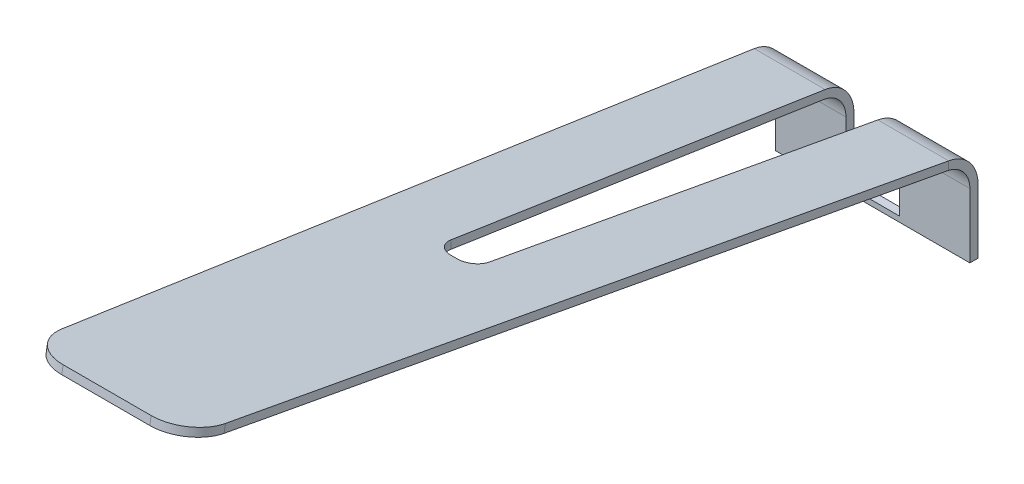
ISO-10303-21;
HEADER;
FILE_DESCRIPTION(('STEP AP214'),'2;1');
FILE_NAME('part.step','',(''),(''),'','','');
FILE_SCHEMA(('AUTOMOTIVE_DESIGN { 1 0 10303 214 1 1 1 1 }'));
ENDSEC;
DATA;
#1=APPLICATION_CONTEXT('core data for automotive mechanical design processes');
#2=APPLICATION_PROTOCOL_DEFINITION('international standard','automotive_design',2000,#1);
#3=PRODUCT_CONTEXT('',#1,'mechanical');
#4=PRODUCT('Part','Part','',(#3));
#5=PRODUCT_RELATED_PRODUCT_CATEGORY('part','',(#4));
#6=PRODUCT_DEFINITION_FORMATION('','',#4);
#7=PRODUCT_DEFINITION_CONTEXT('part definition',#1,'design');
#8=PRODUCT_DEFINITION('design','',#6,#7);
#9=PRODUCT_DEFINITION_SHAPE('','',#8);
#10=(LENGTH_UNIT() NAMED_UNIT(*) SI_UNIT(.MILLI.,.METRE.));
#11=(NAMED_UNIT(*) PLANE_ANGLE_UNIT() SI_UNIT($,.RADIAN.));
#12=(NAMED_UNIT(*) SI_UNIT($,.STERADIAN.) SOLID_ANGLE_UNIT());
#13=UNCERTAINTY_MEASURE_WITH_UNIT(LENGTH_MEASURE(1.E-05),#10,'distance_accuracy_value','');
#14=(GEOMETRIC_REPRESENTATION_CONTEXT(3) GLOBAL_UNCERTAINTY_ASSIGNED_CONTEXT((#13)) GLOBAL_UNIT_ASSIGNED_CONTEXT((#10,
#11,#12)) REPRESENTATION_CONTEXT('',''));
#15=CARTESIAN_POINT('',(0.,0.,0.));
#16=DIRECTION('',(0.,0.,1.));
#17=DIRECTION('',(1.,0.,0.));
#18=AXIS2_PLACEMENT_3D('',#15,#16,#17);
#19=CARTESIAN_POINT('',(1.05,6.68384807831719,-5.1576262837244));
#20=DIRECTION('',(0.,0.986196546599445,-0.165578898037546));
#21=DIRECTION('',(0.,0.165578898037546,0.986196546599445));
#22=AXIS2_PLACEMENT_3D('',#19,#20,#21);
#23=PLANE('',#22);
#24=DIRECTION('',(1.,0.,0.));
#25=VECTOR('',#24,1.);
#26=CARTESIAN_POINT('',(1.05,8.99792948198992,8.62516316529437));
#27=LINE('',#26,#25);
#28=CARTESIAN_POINT('',(2.03462652145605,8.99792948198992,8.62516316529437));
#29=VERTEX_POINT('',#28);
#30=CARTESIAN_POINT('',(3.66537347854396,8.99792948198992,8.62516316529437));
#31=VERTEX_POINT('',#30);
#32=EDGE_CURVE('E250',#29,#31,#27,.T.);
#33=ORIENTED_EDGE('',*,*,#32,.T.);
#34=CARTESIAN_POINT('',(3.66537347854396,8.88202425336363,7.93482558267476));
#35=DIRECTION('',(0.,0.986196546599445,-0.165578898037546));
#36=DIRECTION('',(1.,1.19954462858274E-12,7.14455032749381E-12));
#37=AXIS2_PLACEMENT_3D('',#34,#35,#36);
#38=ELLIPSE('',#37,0.700004529821373,0.7);
#39=CARTESIAN_POINT('',(4.36521737079121,8.88450719351855,7.94961410364701));
#40=VERTEX_POINT('',#39);
#41=EDGE_CURVE('E47',#31,#40,#38,.T.);
#42=ORIENTED_EDGE('',*,*,#41,.T.);
#43=DIRECTION('',(0.0214222968584453,-0.165540900373962,-0.985970230534719));
#44=VECTOR('',#43,1.);
#45=CARTESIAN_POINT('',(4.64834790671031,6.69661463703328,-5.08158799462483));
#46=LINE('',#45,#44);
#47=CARTESIAN_POINT('',(4.65,6.6838480783172,-5.1576262837244));
#48=VERTEX_POINT('',#47);
#49=EDGE_CURVE('E184',#40,#48,#46,.T.);
#50=ORIENTED_EDGE('',*,*,#49,.T.);
#51=DIRECTION('',(1.,0.,0.));
#52=VECTOR('',#51,1.);
#53=CARTESIAN_POINT('',(1.05,6.68384807831719,-5.1576262837244));
#54=LINE('',#53,#52);
#55=CARTESIAN_POINT('',(3.33795549281983,6.68384807831719,-5.1576262837244));
#56=VERTEX_POINT('',#55);
#57=EDGE_CURVE('E188',#56,#48,#54,.T.);
#58=ORIENTED_EDGE('',*,*,#57,.F.);
#59=DIRECTION('',(-0.018488024769816,0.165550597600858,0.986027987723528));
#60=VECTOR('',#59,1.);
#61=CARTESIAN_POINT('',(3.33717345347968,6.69085083181425,-5.11591751891596));
#62=LINE('',#61,#60);
#63=CARTESIAN_POINT('',(3.20551954978455,7.86974272018939,1.9056240114911));
#64=VERTEX_POINT('',#63);
#65=EDGE_CURVE('E360',#56,#64,#62,.T.);
#66=ORIENTED_EDGE('',*,*,#65,.T.);
#67=CARTESIAN_POINT('',(2.90557227025905,7.86879846863177,1.9));
#68=DIRECTION('',(0.,0.986196546599445,-0.165578898037546));
#69=DIRECTION('',(0.,-0.165578898037546,-0.986196546599445));
#70=AXIS2_PLACEMENT_3D('',#67,#68,#69);
#71=ELLIPSE('',#70,0.3041989966751,0.3);
#72=CARTESIAN_POINT('',(2.90557227025904,7.91916740328536,2.2));
#73=VERTEX_POINT('',#72);
#74=EDGE_CURVE('E321',#64,#73,#71,.F.);
#75=ORIENTED_EDGE('',*,*,#74,.T.);
#76=DIRECTION('',(-1.,0.,0.));
#77=VECTOR('',#76,1.);
#78=CARTESIAN_POINT('',(1.05,7.91916740328536,2.2));
#79=LINE('',#78,#77);
#80=CARTESIAN_POINT('',(2.79442772974096,7.91916740328536,2.2));
#81=VERTEX_POINT('',#80);
#82=EDGE_CURVE('E356',#73,#81,#79,.T.);
#83=ORIENTED_EDGE('',*,*,#82,.T.);
#84=CARTESIAN_POINT('',(2.79442772974096,7.86879846863177,1.9));
#85=DIRECTION('',(0.,0.986196546599445,-0.165578898037546));
#86=DIRECTION('',(0.,-0.165578898037546,-0.986196546599445));
#87=AXIS2_PLACEMENT_3D('',#84,#85,#86);
#88=ELLIPSE('',#87,0.3041989966751,0.3);
#89=CARTESIAN_POINT('',(2.49448045021546,7.86974272018939,1.9056240114911));
#90=VERTEX_POINT('',#89);
#91=EDGE_CURVE('E336',#81,#90,#88,.F.);
#92=ORIENTED_EDGE('',*,*,#91,.T.);
#93=DIRECTION('',(-0.0184880247698162,-0.165550597600858,-0.986027987723528));
#94=VECTOR('',#93,1.);
#95=CARTESIAN_POINT('',(2.36159604110473,6.67983229903748,-5.18154447441471));
#96=LINE('',#95,#94);
#97=CARTESIAN_POINT('',(2.36204450718017,6.68384807831719,-5.1576262837244));
#98=VERTEX_POINT('',#97);
#99=EDGE_CURVE('E344',#90,#98,#96,.T.);
#100=ORIENTED_EDGE('',*,*,#99,.T.);
#101=CARTESIAN_POINT('',(1.05,6.68384807831719,-5.1576262837244));
#102=VERTEX_POINT('',#101);
#103=EDGE_CURVE('E207',#102,#98,#54,.T.);
#104=ORIENTED_EDGE('',*,*,#103,.F.);
#105=DIRECTION('',(0.0214222968584453,0.165540900373962,0.985970230534719));
#106=VECTOR('',#105,1.);
#107=CARTESIAN_POINT('',(1.05,6.68384807831719,-5.1576262837244));
#108=LINE('',#107,#106);
#109=CARTESIAN_POINT('',(1.33478262920879,8.88450719351855,7.94961410364701));
#110=VERTEX_POINT('',#109);
#111=EDGE_CURVE('E431',#102,#110,#108,.T.);
#112=ORIENTED_EDGE('',*,*,#111,.T.);
#113=CARTESIAN_POINT('',(2.03462652145605,8.88202425336363,7.93482558267476));
#114=DIRECTION('',(0.,0.986196546599445,-0.165578898037546));
#115=DIRECTION('',(1.,-1.19954462858274E-12,-7.14455032749384E-12));
#116=AXIS2_PLACEMENT_3D('',#113,#114,#115);
#117=ELLIPSE('',#116,0.700004529821373,0.7);
#118=EDGE_CURVE('E54',#110,#29,#117,.T.);
#119=ORIENTED_EDGE('',*,*,#118,.T.);
#120=EDGE_LOOP('',(#33,#42,#50,#58,#66,#75,#83,#92,#100,#104,#112,#119));
#121=FACE_BOUND('',#120,.T.);
#122=ADVANCED_FACE('F38',(#121),#23,.T.);
#123=CARTESIAN_POINT('',(1.05,6.04282032302755,-5.05));
#124=DIRECTION('',(1.,0.,0.));
#125=DIRECTION('',(0.,0.,-1.));
#126=AXIS2_PLACEMENT_3D('',#123,#124,#125);
#127=CYLINDRICAL_SURFACE('',#126,0.65);
#128=DIRECTION('',(1.,0.,0.));
#129=VECTOR('',#128,1.);
#130=CARTESIAN_POINT('',(1.05,6.04282032302755,-5.7));
#131=LINE('',#130,#129);
#132=CARTESIAN_POINT('',(3.348125,6.04282032302755,-5.7));
#133=VERTEX_POINT('',#132);
#134=CARTESIAN_POINT('',(4.65,6.04282032302755,-5.7));
#135=VERTEX_POINT('',#134);
#136=EDGE_CURVE('E257',#133,#135,#131,.T.);
#137=ORIENTED_EDGE('',*,*,#136,.F.);
#138=CARTESIAN_POINT('',(3.3359375,6.04282032302755,-5.05));
#139=DIRECTION('',(-0.999824265084997,0.,-0.0187467049703436));
#140=DIRECTION('',(0.0187467049703436,0.,-0.999824265084997));
#141=AXIS2_PLACEMENT_3D('',#138,#139,#140);
#142=ELLIPSE('',#141,0.650114247772074,0.65);
#143=EDGE_CURVE('E215',#133,#56,#142,.F.);
#144=ORIENTED_EDGE('',*,*,#143,.T.);
#145=ORIENTED_EDGE('',*,*,#57,.T.);
#146=CARTESIAN_POINT('',(4.65,6.04282032302755,-5.05));
#147=DIRECTION('',(1.,0.,0.));
#148=DIRECTION('',(0.,0.,-1.));
#149=AXIS2_PLACEMENT_3D('',#146,#147,#148);
#150=CIRCLE('',#149,0.65);
#151=EDGE_CURVE('E214',#135,#48,#150,.T.);
#152=ORIENTED_EDGE('',*,*,#151,.F.);
#153=EDGE_LOOP('',(#137,#144,#145,#152));
#154=FACE_BOUND('',#153,.T.);
#155=ADVANCED_FACE('F213',(#154),#127,.T.);
#156=ORIENTED_EDGE('',*,*,#103,.T.);
#157=CARTESIAN_POINT('',(2.3640625,6.04282032302755,-5.05));
#158=DIRECTION('',(0.999824265084997,0.,-0.0187467049703438));
#159=DIRECTION('',(0.0187467049703438,0.,0.999824265084997));
#160=AXIS2_PLACEMENT_3D('',#157,#158,#159);
#161=ELLIPSE('',#160,0.650114247772074,0.65);
#162=CARTESIAN_POINT('',(2.351875,6.04282032302755,-5.7));
#163=VERTEX_POINT('',#162);
#164=EDGE_CURVE('E346',#98,#163,#161,.F.);
#165=ORIENTED_EDGE('',*,*,#164,.T.);
#166=CARTESIAN_POINT('',(1.05,6.04282032302755,-5.7));
#167=VERTEX_POINT('',#166);
#168=EDGE_CURVE('E217',#167,#163,#131,.T.);
#169=ORIENTED_EDGE('',*,*,#168,.F.);
#170=CARTESIAN_POINT('',(1.05,6.04282032302755,-5.05));
#171=DIRECTION('',(1.,0.,0.));
#172=DIRECTION('',(0.,0.,-1.));
#173=AXIS2_PLACEMENT_3D('',#170,#171,#172);
#174=CIRCLE('',#173,0.65);
#175=EDGE_CURVE('E247',#167,#102,#174,.T.);
#176=ORIENTED_EDGE('',*,*,#175,.T.);
#177=EDGE_LOOP('',(#156,#165,#169,#176));
#178=FACE_BOUND('',#177,.T.);
#179=ADVANCED_FACE('F441',(#178),#127,.T.);
#180=CARTESIAN_POINT('',(1.05,4.85,-5.7));
#181=DIRECTION('',(0.,0.,-1.));
#182=DIRECTION('',(-1.,0.,0.));
#183=AXIS2_PLACEMENT_3D('',#180,#181,#182);
#184=PLANE('',#183);
#185=DIRECTION('',(1.,0.,0.));
#186=VECTOR('',#185,1.);
#187=CARTESIAN_POINT('',(1.05,4.95,-5.7));
#188=LINE('',#187,#186);
#189=CARTESIAN_POINT('',(2.351875,4.95,-5.7));
#190=VERTEX_POINT('',#189);
#191=CARTESIAN_POINT('',(3.348125,4.95,-5.7));
#192=VERTEX_POINT('',#191);
#193=EDGE_CURVE('E317',#190,#192,#188,.T.);
#194=ORIENTED_EDGE('',*,*,#193,.T.);
#195=DIRECTION('',(0.,1.,0.));
#196=VECTOR('',#195,1.);
#197=CARTESIAN_POINT('',(3.348125,4.85,-5.7));
#198=LINE('',#197,#196);
#199=EDGE_CURVE('E329',#192,#133,#198,.T.);
#200=ORIENTED_EDGE('',*,*,#199,.T.);
#201=ORIENTED_EDGE('',*,*,#136,.T.);
#202=DIRECTION('',(0.,1.,0.));
#203=VECTOR('',#202,1.);
#204=CARTESIAN_POINT('',(4.65,4.85,-5.7));
#205=LINE('',#204,#203);
#206=CARTESIAN_POINT('',(4.65,4.85,-5.7));
#207=VERTEX_POINT('',#206);
#208=EDGE_CURVE('E223',#207,#135,#205,.T.);
#209=ORIENTED_EDGE('',*,*,#208,.F.);
#210=DIRECTION('',(1.,0.,0.));
#211=VECTOR('',#210,1.);
#212=CARTESIAN_POINT('',(1.05,4.85,-5.7));
#213=LINE('',#212,#211);
#214=CARTESIAN_POINT('',(1.05,4.85,-5.7));
#215=VERTEX_POINT('',#214);
#216=EDGE_CURVE('E258',#215,#207,#213,.T.);
#217=ORIENTED_EDGE('',*,*,#216,.F.);
#218=DIRECTION('',(0.,1.,0.));
#219=VECTOR('',#218,1.);
#220=CARTESIAN_POINT('',(1.05,4.85,-5.7));
#221=LINE('',#220,#219);
#222=EDGE_CURVE('E243',#215,#167,#221,.T.);
#223=ORIENTED_EDGE('',*,*,#222,.T.);
#224=ORIENTED_EDGE('',*,*,#168,.T.);
#225=DIRECTION('',(0.,-1.,0.));
#226=VECTOR('',#225,1.);
#227=CARTESIAN_POINT('',(2.351875,4.85,-5.7));
#228=LINE('',#227,#226);
#229=EDGE_CURVE('E339',#163,#190,#228,.T.);
#230=ORIENTED_EDGE('',*,*,#229,.T.);
#231=EDGE_LOOP('',(#194,#200,#201,#209,#217,#223,#224,#230));
#232=FACE_BOUND('',#231,.T.);
#233=ADVANCED_FACE('F410',(#232),#184,.T.);
#234=CARTESIAN_POINT('',(1.05,4.85,-5.55));
#235=DIRECTION('',(0.,0.,-1.));
#236=DIRECTION('',(-1.,0.,0.));
#237=AXIS2_PLACEMENT_3D('',#234,#235,#236);
#238=PLANE('',#237);
#239=DIRECTION('',(0.,1.,0.));
#240=VECTOR('',#239,1.);
#241=CARTESIAN_POINT('',(3.3453125,4.85,-5.55));
#242=LINE('',#241,#240);
#243=CARTESIAN_POINT('',(3.3453125,4.95,-5.55));
#244=VERTEX_POINT('',#243);
#245=CARTESIAN_POINT('',(3.3453125,6.04282032302755,-5.55));
#246=VERTEX_POINT('',#245);
#247=EDGE_CURVE('E327',#244,#246,#242,.T.);
#248=ORIENTED_EDGE('',*,*,#247,.F.);
#249=DIRECTION('',(1.,0.,0.));
#250=VECTOR('',#249,1.);
#251=CARTESIAN_POINT('',(1.05,4.95,-5.55));
#252=LINE('',#251,#250);
#253=CARTESIAN_POINT('',(2.3546875,4.95,-5.55));
#254=VERTEX_POINT('',#253);
#255=EDGE_CURVE('E296',#254,#244,#252,.T.);
#256=ORIENTED_EDGE('',*,*,#255,.F.);
#257=DIRECTION('',(0.,-1.,0.));
#258=VECTOR('',#257,1.);
#259=CARTESIAN_POINT('',(2.3546875,4.85,-5.55));
#260=LINE('',#259,#258);
#261=CARTESIAN_POINT('',(2.3546875,6.04282032302755,-5.55));
#262=VERTEX_POINT('',#261);
#263=EDGE_CURVE('E335',#262,#254,#260,.T.);
#264=ORIENTED_EDGE('',*,*,#263,.F.);
#265=DIRECTION('',(1.,0.,0.));
#266=VECTOR('',#265,1.);
#267=CARTESIAN_POINT('',(1.05,6.04282032302755,-5.55));
#268=LINE('',#267,#266);
#269=CARTESIAN_POINT('',(1.05,6.04282032302755,-5.55));
#270=VERTEX_POINT('',#269);
#271=EDGE_CURVE('E263',#270,#262,#268,.T.);
#272=ORIENTED_EDGE('',*,*,#271,.F.);
#273=DIRECTION('',(0.,1.,0.));
#274=VECTOR('',#273,1.);
#275=CARTESIAN_POINT('',(1.05,4.85,-5.55));
#276=LINE('',#275,#274);
#277=CARTESIAN_POINT('',(1.05,4.85,-5.55));
#278=VERTEX_POINT('',#277);
#279=EDGE_CURVE('E231',#278,#270,#276,.T.);
#280=ORIENTED_EDGE('',*,*,#279,.F.);
#281=DIRECTION('',(1.,0.,0.));
#282=VECTOR('',#281,1.);
#283=CARTESIAN_POINT('',(1.05,4.85,-5.55));
#284=LINE('',#283,#282);
#285=CARTESIAN_POINT('',(4.65,4.85,-5.55));
#286=VERTEX_POINT('',#285);
#287=EDGE_CURVE('E261',#278,#286,#284,.T.);
#288=ORIENTED_EDGE('',*,*,#287,.T.);
#289=DIRECTION('',(0.,1.,0.));
#290=VECTOR('',#289,1.);
#291=CARTESIAN_POINT('',(4.65,4.85,-5.55));
#292=LINE('',#291,#290);
#293=CARTESIAN_POINT('',(4.65,6.04282032302755,-5.55));
#294=VERTEX_POINT('',#293);
#295=EDGE_CURVE('E380',#286,#294,#292,.T.);
#296=ORIENTED_EDGE('',*,*,#295,.T.);
#297=EDGE_CURVE('E267',#246,#294,#268,.T.);
#298=ORIENTED_EDGE('',*,*,#297,.F.);
#299=EDGE_LOOP('',(#248,#256,#264,#272,#280,#288,#296,#298));
#300=FACE_BOUND('',#299,.T.);
#301=ADVANCED_FACE('F400',(#300),#238,.F.);
#302=CARTESIAN_POINT('',(1.05,6.04282032302755,-5.05));
#303=DIRECTION('',(1.,0.,0.));
#304=DIRECTION('',(0.,0.,-1.));
#305=AXIS2_PLACEMENT_3D('',#302,#303,#304);
#306=CYLINDRICAL_SURFACE('',#305,0.5);
#307=CARTESIAN_POINT('',(1.05233840954657,6.04282032302755,-5.05));
#308=DIRECTION('',(-0.999764049589755,0.,0.0217219968670839));
#309=DIRECTION('',(0.0217219968670839,0.,0.999764049589755));
#310=AXIS2_PLACEMENT_3D('',#307,#308,#309);
#311=ELLIPSE('',#310,0.50011800304799,0.5);
#312=CARTESIAN_POINT('',(1.05,6.53109952906819,-5.1576262837244));
#313=VERTEX_POINT('',#312);
#314=CARTESIAN_POINT('',(1.05053963297229,6.53591859632727,-5.13278944901877));
#315=VERTEX_POINT('',#314);
#316=EDGE_CURVE('E428',#313,#315,#311,.F.);
#317=ORIENTED_EDGE('',*,*,#316,.F.);
#318=CARTESIAN_POINT('',(1.05,6.04282032302755,-5.05));
#319=DIRECTION('',(1.,0.,0.));
#320=DIRECTION('',(0.,0.,-1.));
#321=AXIS2_PLACEMENT_3D('',#318,#319,#320);
#322=CIRCLE('',#321,0.5);
#323=EDGE_CURVE('E225',#270,#313,#322,.T.);
#324=ORIENTED_EDGE('',*,*,#323,.F.);
#325=ORIENTED_EDGE('',*,*,#271,.T.);
#326=CARTESIAN_POINT('',(2.3640625,6.04282032302755,-5.05));
#327=DIRECTION('',(0.999824265084997,0.,-0.0187467049703438));
#328=DIRECTION('',(0.0187467049703438,0.,0.999824265084997));
#329=AXIS2_PLACEMENT_3D('',#326,#327,#328);
#330=ELLIPSE('',#329,0.500087882901596,0.5);
#331=CARTESIAN_POINT('',(2.3625101978309,6.53591859632727,-5.13278944901877));
#332=VERTEX_POINT('',#331);
#333=EDGE_CURVE('E333',#332,#262,#330,.F.);
#334=ORIENTED_EDGE('',*,*,#333,.F.);
#335=DIRECTION('',(1.,0.,0.));
#336=VECTOR('',#335,1.);
#337=CARTESIAN_POINT('',(1.05,6.53591859632727,-5.13278944901877));
#338=LINE('',#337,#336);
#339=EDGE_CURVE('E272',#315,#332,#338,.T.);
#340=ORIENTED_EDGE('',*,*,#339,.F.);
#341=EDGE_LOOP('',(#317,#324,#325,#334,#340));
#342=FACE_BOUND('',#341,.T.);
#343=ADVANCED_FACE('F464',(#342),#306,.F.);
#344=CARTESIAN_POINT('',(4.64766159045343,6.04282032302755,-5.05));
#345=DIRECTION('',(0.999764049589755,0.,0.0217219968670839));
#346=DIRECTION('',(0.0217219968670839,0.,-0.999764049589755));
#347=AXIS2_PLACEMENT_3D('',#344,#345,#346);
#348=ELLIPSE('',#347,0.50011800304799,0.5);
#349=CARTESIAN_POINT('',(4.64946036702772,6.53591859632727,-5.13278944901877));
#350=VERTEX_POINT('',#349);
#351=CARTESIAN_POINT('',(4.65,6.53109952906819,-5.15762628372436));
#352=VERTEX_POINT('',#351);
#353=EDGE_CURVE('E195',#350,#352,#348,.F.);
#354=ORIENTED_EDGE('',*,*,#353,.F.);
#355=CARTESIAN_POINT('',(3.3374898021691,6.53591859632727,-5.13278944901877));
#356=VERTEX_POINT('',#355);
#357=EDGE_CURVE('E268',#356,#350,#338,.T.);
#358=ORIENTED_EDGE('',*,*,#357,.F.);
#359=CARTESIAN_POINT('',(3.3359375,6.04282032302755,-5.05));
#360=DIRECTION('',(-0.999824265084997,0.,-0.0187467049703436));
#361=DIRECTION('',(0.0187467049703436,0.,-0.999824265084997));
#362=AXIS2_PLACEMENT_3D('',#359,#360,#361);
#363=ELLIPSE('',#362,0.500087882901596,0.5);
#364=EDGE_CURVE('E330',#246,#356,#363,.F.);
#365=ORIENTED_EDGE('',*,*,#364,.F.);
#366=ORIENTED_EDGE('',*,*,#297,.T.);
#367=CARTESIAN_POINT('',(4.65,6.04282032302755,-5.05));
#368=DIRECTION('',(1.,0.,0.));
#369=DIRECTION('',(0.,0.,-1.));
#370=AXIS2_PLACEMENT_3D('',#367,#368,#369);
#371=CIRCLE('',#370,0.5);
#372=EDGE_CURVE('E320',#294,#352,#371,.T.);
#373=ORIENTED_EDGE('',*,*,#372,.T.);
#374=EDGE_LOOP('',(#354,#358,#365,#366,#373));
#375=FACE_BOUND('',#374,.T.);
#376=ADVANCED_FACE('F475',(#375),#306,.F.);
#377=CARTESIAN_POINT('',(1.05,6.53591859632727,-5.13278944901877));
#378=DIRECTION('',(0.,0.986196546599445,-0.165578898037546));
#379=DIRECTION('',(0.,0.165578898037546,0.986196546599446));
#380=AXIS2_PLACEMENT_3D('',#377,#378,#379);
#381=PLANE('',#380);
#382=DIRECTION('',(0.0214222968584453,-0.165540900373961,-0.985970230534719));
#383=VECTOR('',#382,1.);
#384=CARTESIAN_POINT('',(4.64780852138359,6.54868324136113,-5.05676255791029));
#385=LINE('',#384,#383);
#386=CARTESIAN_POINT('',(4.36467773781893,8.73657771152863,7.97445093835264));
#387=VERTEX_POINT('',#386);
#388=EDGE_CURVE('E323',#387,#350,#385,.T.);
#389=ORIENTED_EDGE('',*,*,#388,.F.);
#390=CARTESIAN_POINT('',(3.66483384557167,8.73409477137372,7.95966241738039));
#391=DIRECTION('',(0.,0.986196546599445,-0.165578898037546));
#392=DIRECTION('',(1.,1.19826715826476E-12,7.13694164769883E-12));
#393=AXIS2_PLACEMENT_3D('',#390,#391,#392);
#394=ELLIPSE('',#393,0.700004529821373,0.7);
#395=CARTESIAN_POINT('',(3.66483384557167,8.85,8.65));
#396=VERTEX_POINT('',#395);
#397=EDGE_CURVE('E305',#387,#396,#394,.F.);
#398=ORIENTED_EDGE('',*,*,#397,.T.);
#399=DIRECTION('',(1.,0.,0.));
#400=VECTOR('',#399,1.);
#401=CARTESIAN_POINT('',(1.05,8.85,8.65));
#402=LINE('',#401,#400);
#403=CARTESIAN_POINT('',(2.03516615442833,8.85,8.65));
#404=VERTEX_POINT('',#403);
#405=EDGE_CURVE('E273',#404,#396,#402,.T.);
#406=ORIENTED_EDGE('',*,*,#405,.F.);
#407=CARTESIAN_POINT('',(2.03516615442833,8.73409477137372,7.95966241738039));
#408=DIRECTION('',(0.,0.986196546599445,-0.165578898037546));
#409=DIRECTION('',(1.,-1.19826715826476E-12,-7.13694164769885E-12));
#410=AXIS2_PLACEMENT_3D('',#407,#408,#409);
#411=ELLIPSE('',#410,0.700004529821373,0.7);
#412=CARTESIAN_POINT('',(1.33532226218108,8.73657771152863,7.97445093835264));
#413=VERTEX_POINT('',#412);
#414=EDGE_CURVE('E302',#404,#413,#411,.F.);
#415=ORIENTED_EDGE('',*,*,#414,.T.);
#416=DIRECTION('',(0.0214222968584453,0.165540900373961,0.985970230534719));
#417=VECTOR('',#416,1.);
#418=CARTESIAN_POINT('',(1.05053938532673,6.53591668264504,-5.13280084700987));
#419=LINE('',#418,#417);
#420=EDGE_CURVE('E194',#315,#413,#419,.T.);
#421=ORIENTED_EDGE('',*,*,#420,.F.);
#422=ORIENTED_EDGE('',*,*,#339,.T.);
#423=DIRECTION('',(-0.0184880247698162,-0.165550597600858,-0.986027987723528));
#424=VECTOR('',#423,1.);
#425=CARTESIAN_POINT('',(2.3620615725791,6.53190139170654,-5.15671612911452));
#426=LINE('',#425,#424);
#427=CARTESIAN_POINT('',(2.49448045021546,7.71764322185184,1.9056240114911));
#428=VERTEX_POINT('',#427);
#429=EDGE_CURVE('E286',#428,#332,#426,.T.);
#430=ORIENTED_EDGE('',*,*,#429,.F.);
#431=CARTESIAN_POINT('',(2.79442772974096,7.71669897029422,1.9));
#432=DIRECTION('',(0.,0.986196546599445,-0.165578898037546));
#433=DIRECTION('',(0.,-0.165578898037546,-0.986196546599446));
#434=AXIS2_PLACEMENT_3D('',#431,#432,#433);
#435=ELLIPSE('',#434,0.3041989966751,0.3);
#436=CARTESIAN_POINT('',(2.79442772974096,7.76706790494781,2.2));
#437=VERTEX_POINT('',#436);
#438=EDGE_CURVE('E283',#437,#428,#435,.F.);
#439=ORIENTED_EDGE('',*,*,#438,.F.);
#440=DIRECTION('',(-1.,0.,0.));
#441=VECTOR('',#440,1.);
#442=CARTESIAN_POINT('',(1.05,7.76706790494781,2.2));
#443=LINE('',#442,#441);
#444=CARTESIAN_POINT('',(2.90557227025904,7.76706790494781,2.2));
#445=VERTEX_POINT('',#444);
#446=EDGE_CURVE('E280',#445,#437,#443,.T.);
#447=ORIENTED_EDGE('',*,*,#446,.F.);
#448=CARTESIAN_POINT('',(2.90557227025905,7.71669897029422,1.9));
#449=DIRECTION('',(0.,0.986196546599445,-0.165578898037546));
#450=DIRECTION('',(0.,-0.165578898037546,-0.986196546599446));
#451=AXIS2_PLACEMENT_3D('',#448,#449,#450);
#452=ELLIPSE('',#451,0.3041989966751,0.3);
#453=CARTESIAN_POINT('',(3.20551954978455,7.71764322185184,1.9056240114911));
#454=VERTEX_POINT('',#453);
#455=EDGE_CURVE('E289',#454,#445,#452,.F.);
#456=ORIENTED_EDGE('',*,*,#455,.F.);
#457=DIRECTION('',(-0.018488024769816,0.165550597600858,0.986027987723528));
#458=VECTOR('',#457,1.);
#459=CARTESIAN_POINT('',(3.3367079220053,6.54291992448331,-5.09108917361577));
#460=LINE('',#459,#458);
#461=EDGE_CURVE('E293',#356,#454,#460,.T.);
#462=ORIENTED_EDGE('',*,*,#461,.F.);
#463=ORIENTED_EDGE('',*,*,#357,.T.);
#464=EDGE_LOOP('',(#389,#398,#406,#415,#421,#422,#430,#439,#447,#456,#462,#463));
#465=FACE_BOUND('',#464,.T.);
#466=ADVANCED_FACE('F458',(#465),#381,.F.);
#467=CARTESIAN_POINT('',(1.05,8.85,8.65));
#468=DIRECTION('',(0.,-0.16557889803752,-0.98619654659945));
#469=DIRECTION('',(0.,0.98619654659945,-0.16557889803752));
#470=AXIS2_PLACEMENT_3D('',#467,#468,#469);
#471=PLANE('',#470);
#472=ORIENTED_EDGE('',*,*,#405,.T.);
#473=DIRECTION('',(-0.00359752986832795,-0.986190164791897,0.165577826554695));
#474=VECTOR('',#473,1.);
#475=CARTESIAN_POINT('',(3.66538234611585,9.00036034775365,8.62475503156502));
#476=LINE('',#475,#474);
#477=EDGE_CURVE('E61',#396,#31,#476,.F.);
#478=ORIENTED_EDGE('',*,*,#477,.T.);
#479=ORIENTED_EDGE('',*,*,#32,.F.);
#480=DIRECTION('',(-0.00359752986832794,0.986190164791897,-0.165577826554695));
#481=VECTOR('',#480,1.);
#482=CARTESIAN_POINT('',(2.03515728685643,8.85243086576373,8.64959186627065));
#483=LINE('',#482,#481);
#484=EDGE_CURVE('E308',#29,#404,#483,.F.);
#485=ORIENTED_EDGE('',*,*,#484,.T.);
#486=EDGE_LOOP('',(#472,#478,#479,#485));
#487=FACE_BOUND('',#486,.T.);
#488=ADVANCED_FACE('F470',(#487),#471,.F.);
#489=CARTESIAN_POINT('',(1.05,6.04282032302755,-5.05));
#490=DIRECTION('',(1.,0.,0.));
#491=DIRECTION('',(0.,0.,-1.));
#492=AXIS2_PLACEMENT_3D('',#489,#490,#491);
#493=PLANE('',#492);
#494=DIRECTION('',(0.,-1.,0.));
#495=VECTOR('',#494,1.);
#496=CARTESIAN_POINT('',(1.05,6.04282032302755,-5.1576262837244));
#497=LINE('',#496,#495);
#498=EDGE_CURVE('E206',#102,#313,#497,.T.);
#499=ORIENTED_EDGE('',*,*,#498,.F.);
#500=ORIENTED_EDGE('',*,*,#175,.F.);
#501=ORIENTED_EDGE('',*,*,#222,.F.);
#502=DIRECTION('',(0.,0.,1.));
#503=VECTOR('',#502,1.);
#504=CARTESIAN_POINT('',(1.05,4.85,-5.7));
#505=LINE('',#504,#503);
#506=EDGE_CURVE('E240',#215,#278,#505,.T.);
#507=ORIENTED_EDGE('',*,*,#506,.T.);
#508=ORIENTED_EDGE('',*,*,#279,.T.);
#509=ORIENTED_EDGE('',*,*,#323,.T.);
#510=EDGE_LOOP('',(#499,#500,#501,#507,#508,#509));
#511=FACE_BOUND('',#510,.T.);
#512=ADVANCED_FACE('F406',(#511),#493,.F.);
#513=CARTESIAN_POINT('',(4.65,6.04282032302755,-5.05));
#514=DIRECTION('',(1.,0.,0.));
#515=DIRECTION('',(0.,0.,-1.));
#516=AXIS2_PLACEMENT_3D('',#513,#514,#515);
#517=PLANE('',#516);
#518=ORIENTED_EDGE('',*,*,#151,.T.);
#519=DIRECTION('',(0.,-1.,0.));
#520=VECTOR('',#519,1.);
#521=CARTESIAN_POINT('',(4.65,6.04282032302755,-5.15762628372436));
#522=LINE('',#521,#520);
#523=EDGE_CURVE('E198',#48,#352,#522,.T.);
#524=ORIENTED_EDGE('',*,*,#523,.T.);
#525=ORIENTED_EDGE('',*,*,#372,.F.);
#526=ORIENTED_EDGE('',*,*,#295,.F.);
#527=DIRECTION('',(0.,0.,1.));
#528=VECTOR('',#527,1.);
#529=CARTESIAN_POINT('',(4.65,4.85,-5.7));
#530=LINE('',#529,#528);
#531=EDGE_CURVE('E234',#207,#286,#530,.T.);
#532=ORIENTED_EDGE('',*,*,#531,.F.);
#533=ORIENTED_EDGE('',*,*,#208,.T.);
#534=EDGE_LOOP('',(#518,#524,#525,#526,#532,#533));
#535=FACE_BOUND('',#534,.T.);
#536=ADVANCED_FACE('F220',(#535),#517,.T.);
#537=CARTESIAN_POINT('',(1.05,4.85,-5.7));
#538=DIRECTION('',(0.,1.,0.));
#539=DIRECTION('',(0.,0.,1.));
#540=AXIS2_PLACEMENT_3D('',#537,#538,#539);
#541=PLANE('',#540);
#542=ORIENTED_EDGE('',*,*,#216,.T.);
#543=ORIENTED_EDGE('',*,*,#531,.T.);
#544=ORIENTED_EDGE('',*,*,#287,.F.);
#545=ORIENTED_EDGE('',*,*,#506,.F.);
#546=EDGE_LOOP('',(#542,#543,#544,#545));
#547=FACE_BOUND('',#546,.T.);
#548=ADVANCED_FACE('F393',(#547),#541,.F.);
#549=CARTESIAN_POINT('',(4.65,8.99792948198992,-5.1576262837244));
#550=DIRECTION('',(0.999764049589755,0.,0.0217219968670839));
#551=DIRECTION('',(0.0217219968670839,0.,-0.999764049589755));
#552=AXIS2_PLACEMENT_3D('',#549,#550,#551);
#553=PLANE('',#552);
#554=ORIENTED_EDGE('',*,*,#49,.F.);
#555=DIRECTION('',(-0.00359752986832795,-0.986190164791897,0.165577826554695));
#556=VECTOR('',#555,1.);
#557=CARTESIAN_POINT('',(4.3646775478564,8.73652563713747,7.97445968145799));
#558=LINE('',#557,#556);
#559=EDGE_CURVE('E299',#40,#387,#558,.T.);
#560=ORIENTED_EDGE('',*,*,#559,.T.);
#561=ORIENTED_EDGE('',*,*,#388,.T.);
#562=ORIENTED_EDGE('',*,*,#353,.T.);
#563=ORIENTED_EDGE('',*,*,#523,.F.);
#564=EDGE_LOOP('',(#554,#560,#561,#562,#563));
#565=FACE_BOUND('',#564,.T.);
#566=ADVANCED_FACE('F199',(#565),#553,.T.);
#567=CARTESIAN_POINT('',(1.05,8.99792948198992,-5.1576262837244));
#568=DIRECTION('',(-0.999764049589755,0.,0.0217219968670839));
#569=DIRECTION('',(0.0217219968670839,0.,0.999764049589755));
#570=AXIS2_PLACEMENT_3D('',#567,#568,#569);
#571=PLANE('',#570);
#572=ORIENTED_EDGE('',*,*,#420,.T.);
#573=DIRECTION('',(-0.00359752986832794,0.986190164791897,-0.165577826554695));
#574=VECTOR('',#573,1.);
#575=CARTESIAN_POINT('',(1.33478281917132,8.88445511912738,7.94962284675237));
#576=LINE('',#575,#574);
#577=EDGE_CURVE('E11',#413,#110,#576,.T.);
#578=ORIENTED_EDGE('',*,*,#577,.T.);
#579=ORIENTED_EDGE('',*,*,#111,.F.);
#580=ORIENTED_EDGE('',*,*,#498,.T.);
#581=ORIENTED_EDGE('',*,*,#316,.T.);
#582=EDGE_LOOP('',(#572,#578,#579,#580,#581));
#583=FACE_BOUND('',#582,.T.);
#584=ADVANCED_FACE('F469',(#583),#571,.T.);
#585=CARTESIAN_POINT('',(2.90557227025905,4.95,1.9));
#586=DIRECTION('',(0.,1.,0.));
#587=DIRECTION('',(0.,0.,1.));
#588=AXIS2_PLACEMENT_3D('',#585,#586,#587);
#589=PLANE('',#588);
#590=DIRECTION('',(0.0187467049703438,0.,0.999824265084997));
#591=VECTOR('',#590,1.);
#592=CARTESIAN_POINT('',(2.49448045021546,4.95,1.9056240114911));
#593=LINE('',#592,#591);
#594=EDGE_CURVE('E365',#190,#254,#593,.T.);
#595=ORIENTED_EDGE('',*,*,#594,.T.);
#596=ORIENTED_EDGE('',*,*,#255,.T.);
#597=DIRECTION('',(0.0187467049703436,0.,-0.999824265084997));
#598=VECTOR('',#597,1.);
#599=CARTESIAN_POINT('',(3.20551954978455,4.95,1.9056240114911));
#600=LINE('',#599,#598);
#601=EDGE_CURVE('E367',#244,#192,#600,.T.);
#602=ORIENTED_EDGE('',*,*,#601,.T.);
#603=ORIENTED_EDGE('',*,*,#193,.F.);
#604=EDGE_LOOP('',(#595,#596,#602,#603));
#605=FACE_BOUND('',#604,.T.);
#606=ADVANCED_FACE('F479',(#605),#589,.T.);
#607=CARTESIAN_POINT('',(2.90557227025905,8.99792948198992,1.9));
#608=DIRECTION('',(0.,-1.,0.));
#609=DIRECTION('',(0.,0.,-1.));
#610=AXIS2_PLACEMENT_3D('',#607,#608,#609);
#611=CYLINDRICAL_SURFACE('',#610,0.3);
#612=DIRECTION('',(0.,-1.,0.));
#613=VECTOR('',#612,1.);
#614=CARTESIAN_POINT('',(3.20551954978455,8.99792948198992,1.9056240114911));
#615=LINE('',#614,#613);
#616=EDGE_CURVE('E325',#64,#454,#615,.T.);
#617=ORIENTED_EDGE('',*,*,#616,.T.);
#618=ORIENTED_EDGE('',*,*,#455,.T.);
#619=DIRECTION('',(0.,-1.,0.));
#620=VECTOR('',#619,1.);
#621=CARTESIAN_POINT('',(2.90557227025904,8.99792948198992,2.2));
#622=LINE('',#621,#620);
#623=EDGE_CURVE('E362',#73,#445,#622,.T.);
#624=ORIENTED_EDGE('',*,*,#623,.F.);
#625=ORIENTED_EDGE('',*,*,#74,.F.);
#626=EDGE_LOOP('',(#617,#618,#624,#625));
#627=FACE_BOUND('',#626,.T.);
#628=ADVANCED_FACE('F481',(#627),#611,.F.);
#629=CARTESIAN_POINT('',(3.20551954978455,8.99792948198992,1.9056240114911));
#630=DIRECTION('',(-0.999824265084997,0.,-0.0187467049703436));
#631=DIRECTION('',(-0.0187467049703436,0.,0.999824265084997));
#632=AXIS2_PLACEMENT_3D('',#629,#630,#631);
#633=PLANE('',#632);
#634=ORIENTED_EDGE('',*,*,#143,.F.);
#635=ORIENTED_EDGE('',*,*,#199,.F.);
#636=ORIENTED_EDGE('',*,*,#601,.F.);
#637=ORIENTED_EDGE('',*,*,#247,.T.);
#638=ORIENTED_EDGE('',*,*,#364,.T.);
#639=ORIENTED_EDGE('',*,*,#461,.T.);
#640=ORIENTED_EDGE('',*,*,#616,.F.);
#641=ORIENTED_EDGE('',*,*,#65,.F.);
#642=EDGE_LOOP('',(#634,#635,#636,#637,#638,#639,#640,#641));
#643=FACE_BOUND('',#642,.T.);
#644=ADVANCED_FACE('F414',(#643),#633,.T.);
#645=CARTESIAN_POINT('',(2.49448045021546,8.99792948198992,1.9056240114911));
#646=DIRECTION('',(0.999824265084997,0.,-0.0187467049703438));
#647=DIRECTION('',(-0.0187467049703438,0.,-0.999824265084997));
#648=AXIS2_PLACEMENT_3D('',#645,#646,#647);
#649=PLANE('',#648);
#650=DIRECTION('',(0.,-1.,0.));
#651=VECTOR('',#650,1.);
#652=CARTESIAN_POINT('',(2.49448045021546,8.99792948198992,1.9056240114911));
#653=LINE('',#652,#651);
#654=EDGE_CURVE('E372',#90,#428,#653,.T.);
#655=ORIENTED_EDGE('',*,*,#654,.T.);
#656=ORIENTED_EDGE('',*,*,#429,.T.);
#657=ORIENTED_EDGE('',*,*,#333,.T.);
#658=ORIENTED_EDGE('',*,*,#263,.T.);
#659=ORIENTED_EDGE('',*,*,#594,.F.);
#660=ORIENTED_EDGE('',*,*,#229,.F.);
#661=ORIENTED_EDGE('',*,*,#164,.F.);
#662=ORIENTED_EDGE('',*,*,#99,.F.);
#663=EDGE_LOOP('',(#655,#656,#657,#658,#659,#660,#661,#662));
#664=FACE_BOUND('',#663,.T.);
#665=ADVANCED_FACE('F444',(#664),#649,.T.);
#666=CARTESIAN_POINT('',(2.79442772974096,8.99792948198992,1.9));
#667=DIRECTION('',(0.,-1.,0.));
#668=DIRECTION('',(0.,0.,-1.));
#669=AXIS2_PLACEMENT_3D('',#666,#667,#668);
#670=CYLINDRICAL_SURFACE('',#669,0.3);
#671=DIRECTION('',(0.,-1.,0.));
#672=VECTOR('',#671,1.);
#673=CARTESIAN_POINT('',(2.79442772974096,8.99792948198992,2.2));
#674=LINE('',#673,#672);
#675=EDGE_CURVE('E364',#81,#437,#674,.T.);
#676=ORIENTED_EDGE('',*,*,#675,.T.);
#677=ORIENTED_EDGE('',*,*,#438,.T.);
#678=ORIENTED_EDGE('',*,*,#654,.F.);
#679=ORIENTED_EDGE('',*,*,#91,.F.);
#680=EDGE_LOOP('',(#676,#677,#678,#679));
#681=FACE_BOUND('',#680,.T.);
#682=ADVANCED_FACE('F450',(#681),#670,.F.);
#683=CARTESIAN_POINT('',(2.79442772974096,8.99792948198992,2.2));
#684=DIRECTION('',(0.,0.,-1.));
#685=DIRECTION('',(-1.,0.,0.));
#686=AXIS2_PLACEMENT_3D('',#683,#684,#685);
#687=PLANE('',#686);
#688=ORIENTED_EDGE('',*,*,#623,.T.);
#689=ORIENTED_EDGE('',*,*,#446,.T.);
#690=ORIENTED_EDGE('',*,*,#675,.F.);
#691=ORIENTED_EDGE('',*,*,#82,.F.);
#692=EDGE_LOOP('',(#688,#689,#690,#691));
#693=FACE_BOUND('',#692,.T.);
#694=ADVANCED_FACE('F453',(#693),#687,.T.);
#695=CARTESIAN_POINT('',(3.67359623220557,11.1361261191979,7.55636988406569));
#696=DIRECTION('',(0.00359752986832795,0.986190164791897,-0.165577826554695));
#697=DIRECTION('',(0.,0.16557889803752,0.98619654659945));
#698=AXIS2_PLACEMENT_3D('',#695,#696,#697);
#699=CYLINDRICAL_SURFACE('',#698,0.7);
#700=ORIENTED_EDGE('',*,*,#41,.F.);
#701=ORIENTED_EDGE('',*,*,#477,.F.);
#702=ORIENTED_EDGE('',*,*,#397,.F.);
#703=ORIENTED_EDGE('',*,*,#559,.F.);
#704=EDGE_LOOP('',(#700,#701,#702,#703));
#705=FACE_BOUND('',#704,.T.);
#706=ADVANCED_FACE('F472',(#705),#699,.T.);
#707=CARTESIAN_POINT('',(2.02640376779443,11.1361261191979,7.55636988406569));
#708=DIRECTION('',(0.00359752986832794,-0.986190164791897,0.165577826554695));
#709=DIRECTION('',(0.,-0.16557889803752,-0.98619654659945));
#710=AXIS2_PLACEMENT_3D('',#707,#708,#709);
#711=CYLINDRICAL_SURFACE('',#710,0.7);
#712=ORIENTED_EDGE('',*,*,#414,.F.);
#713=ORIENTED_EDGE('',*,*,#484,.F.);
#714=ORIENTED_EDGE('',*,*,#118,.F.);
#715=ORIENTED_EDGE('',*,*,#577,.F.);
#716=EDGE_LOOP('',(#712,#713,#714,#715));
#717=FACE_BOUND('',#716,.T.);
#718=ADVANCED_FACE('F40',(#717),#711,.T.);
#719=CLOSED_SHELL('',(#122,#155,#179,#233,#301,#343,#376,#466,#488,#512,#536,#548,#566,#584,
#606,#628,#644,#665,#682,#694,#706,#718));
#720=MANIFOLD_SOLID_BREP('B2',#719);
#721=ADVANCED_BREP_SHAPE_REPRESENTATION('',(#18,#720),#14);
#722=SHAPE_DEFINITION_REPRESENTATION(#9,#721);
ENDSEC;
END-ISO-10303-21;
